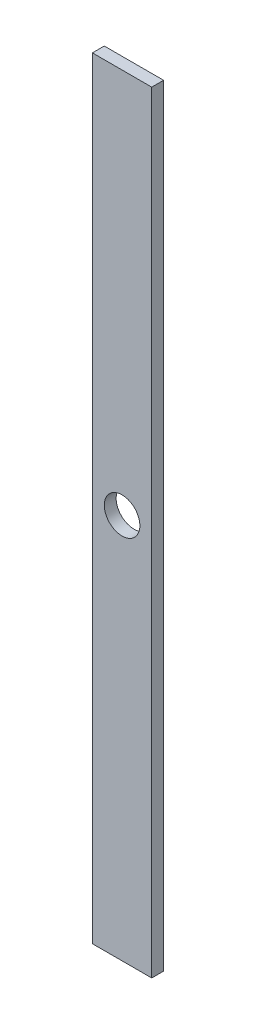
ISO-10303-21;
HEADER;
FILE_DESCRIPTION(('STEP AP214'),'2;1');
FILE_NAME('part.step','',(''),(''),'','','');
FILE_SCHEMA(('AUTOMOTIVE_DESIGN { 1 0 10303 214 1 1 1 1 }'));
ENDSEC;
DATA;
#1=APPLICATION_CONTEXT('core data for automotive mechanical design processes');
#2=APPLICATION_PROTOCOL_DEFINITION('international standard','automotive_design',2000,#1);
#3=PRODUCT_CONTEXT('',#1,'mechanical');
#4=PRODUCT('Part','Part','',(#3));
#5=PRODUCT_RELATED_PRODUCT_CATEGORY('part','',(#4));
#6=PRODUCT_DEFINITION_FORMATION('','',#4);
#7=PRODUCT_DEFINITION_CONTEXT('part definition',#1,'design');
#8=PRODUCT_DEFINITION('design','',#6,#7);
#9=PRODUCT_DEFINITION_SHAPE('','',#8);
#10=(LENGTH_UNIT() NAMED_UNIT(*) SI_UNIT(.MILLI.,.METRE.));
#11=(NAMED_UNIT(*) PLANE_ANGLE_UNIT() SI_UNIT($,.RADIAN.));
#12=(NAMED_UNIT(*) SI_UNIT($,.STERADIAN.) SOLID_ANGLE_UNIT());
#13=UNCERTAINTY_MEASURE_WITH_UNIT(LENGTH_MEASURE(1.E-05),#10,'distance_accuracy_value','');
#14=(GEOMETRIC_REPRESENTATION_CONTEXT(3) GLOBAL_UNCERTAINTY_ASSIGNED_CONTEXT((#13)) GLOBAL_UNIT_ASSIGNED_CONTEXT((#10,
#11,#12)) REPRESENTATION_CONTEXT('',''));
#15=CARTESIAN_POINT('',(0.,0.,0.));
#16=DIRECTION('',(0.,0.,1.));
#17=DIRECTION('',(1.,0.,0.));
#18=AXIS2_PLACEMENT_3D('',#15,#16,#17);
#19=CARTESIAN_POINT('',(0.,0.,10.));
#20=DIRECTION('',(0.,0.,1.));
#21=DIRECTION('',(1.,0.,0.));
#22=AXIS2_PLACEMENT_3D('',#19,#20,#21);
#23=PLANE('',#22);
#24=DIRECTION('',(0.,-1.,0.));
#25=VECTOR('',#24,1.);
#26=CARTESIAN_POINT('',(0.,0.,10.));
#27=LINE('',#26,#25);
#28=CARTESIAN_POINT('',(0.,0.,10.));
#29=VERTEX_POINT('',#28);
#30=CARTESIAN_POINT('',(0.,-650.,10.));
#31=VERTEX_POINT('',#30);
#32=EDGE_CURVE('E85',#29,#31,#27,.T.);
#33=ORIENTED_EDGE('',*,*,#32,.T.);
#34=DIRECTION('',(1.,0.,0.));
#35=VECTOR('',#34,1.);
#36=CARTESIAN_POINT('',(0.,-650.,10.));
#37=LINE('',#36,#35);
#38=CARTESIAN_POINT('',(50.0000000000001,-650.,10.));
#39=VERTEX_POINT('',#38);
#40=EDGE_CURVE('E80',#31,#39,#37,.T.);
#41=ORIENTED_EDGE('',*,*,#40,.T.);
#42=DIRECTION('',(0.,1.,0.));
#43=VECTOR('',#42,1.);
#44=CARTESIAN_POINT('',(50.,0.,10.));
#45=LINE('',#44,#43);
#46=CARTESIAN_POINT('',(50.,0.,10.));
#47=VERTEX_POINT('',#46);
#48=EDGE_CURVE('E83',#39,#47,#45,.T.);
#49=ORIENTED_EDGE('',*,*,#48,.T.);
#50=DIRECTION('',(-1.,0.,0.));
#51=VECTOR('',#50,1.);
#52=CARTESIAN_POINT('',(0.,0.,10.));
#53=LINE('',#52,#51);
#54=EDGE_CURVE('E50',#47,#29,#53,.T.);
#55=ORIENTED_EDGE('',*,*,#54,.T.);
#56=EDGE_LOOP('',(#33,#41,#49,#55));
#57=FACE_BOUND('',#56,.T.);
#58=CARTESIAN_POINT('',(25.,-325.,10.));
#59=DIRECTION('',(0.,0.,1.));
#60=DIRECTION('',(1.,0.,0.));
#61=AXIS2_PLACEMENT_3D('',#58,#59,#60);
#62=CIRCLE('',#61,15.);
#63=CARTESIAN_POINT('',(40.,-325.,10.));
#64=VERTEX_POINT('',#63);
#65=EDGE_CURVE('E100',#64,#64,#62,.T.);
#66=ORIENTED_EDGE('',*,*,#65,.F.);
#67=EDGE_LOOP('',(#66));
#68=FACE_BOUND('',#67,.T.);
#69=ADVANCED_FACE('F33',(#57,#68),#23,.T.);
#70=CARTESIAN_POINT('',(0.,0.,0.));
#71=DIRECTION('',(0.,0.,1.));
#72=DIRECTION('',(1.,0.,0.));
#73=AXIS2_PLACEMENT_3D('',#70,#71,#72);
#74=PLANE('',#73);
#75=DIRECTION('',(0.,-1.,0.));
#76=VECTOR('',#75,1.);
#77=CARTESIAN_POINT('',(0.,0.,0.));
#78=LINE('',#77,#76);
#79=CARTESIAN_POINT('',(0.,0.,0.));
#80=VERTEX_POINT('',#79);
#81=CARTESIAN_POINT('',(0.,-650.,0.));
#82=VERTEX_POINT('',#81);
#83=EDGE_CURVE('E97',#80,#82,#78,.T.);
#84=ORIENTED_EDGE('',*,*,#83,.F.);
#85=DIRECTION('',(-1.,0.,0.));
#86=VECTOR('',#85,1.);
#87=CARTESIAN_POINT('',(0.,0.,0.));
#88=LINE('',#87,#86);
#89=CARTESIAN_POINT('',(50.,0.,0.));
#90=VERTEX_POINT('',#89);
#91=EDGE_CURVE('E73',#90,#80,#88,.T.);
#92=ORIENTED_EDGE('',*,*,#91,.F.);
#93=DIRECTION('',(0.,1.,0.));
#94=VECTOR('',#93,1.);
#95=CARTESIAN_POINT('',(50.,0.,0.));
#96=LINE('',#95,#94);
#97=CARTESIAN_POINT('',(50.0000000000001,-650.,0.));
#98=VERTEX_POINT('',#97);
#99=EDGE_CURVE('E67',#98,#90,#96,.T.);
#100=ORIENTED_EDGE('',*,*,#99,.F.);
#101=DIRECTION('',(1.,0.,0.));
#102=VECTOR('',#101,1.);
#103=CARTESIAN_POINT('',(0.,-650.,0.));
#104=LINE('',#103,#102);
#105=EDGE_CURVE('E89',#82,#98,#104,.T.);
#106=ORIENTED_EDGE('',*,*,#105,.F.);
#107=EDGE_LOOP('',(#84,#92,#100,#106));
#108=FACE_BOUND('',#107,.T.);
#109=CARTESIAN_POINT('',(25.,-325.,0.));
#110=DIRECTION('',(0.,0.,1.));
#111=DIRECTION('',(1.,0.,0.));
#112=AXIS2_PLACEMENT_3D('',#109,#110,#111);
#113=CIRCLE('',#112,15.);
#114=CARTESIAN_POINT('',(40.,-325.,0.));
#115=VERTEX_POINT('',#114);
#116=EDGE_CURVE('E112',#115,#115,#113,.T.);
#117=ORIENTED_EDGE('',*,*,#116,.T.);
#118=EDGE_LOOP('',(#117));
#119=FACE_BOUND('',#118,.T.);
#120=ADVANCED_FACE('F108',(#108,#119),#74,.F.);
#121=CARTESIAN_POINT('',(0.,0.,10.));
#122=DIRECTION('',(1.,0.,0.));
#123=DIRECTION('',(0.,1.,0.));
#124=AXIS2_PLACEMENT_3D('',#121,#122,#123);
#125=PLANE('',#124);
#126=ORIENTED_EDGE('',*,*,#83,.T.);
#127=DIRECTION('',(0.,0.,-1.));
#128=VECTOR('',#127,1.);
#129=CARTESIAN_POINT('',(0.,-650.,10.));
#130=LINE('',#129,#128);
#131=EDGE_CURVE('E11',#31,#82,#130,.T.);
#132=ORIENTED_EDGE('',*,*,#131,.F.);
#133=ORIENTED_EDGE('',*,*,#32,.F.);
#134=DIRECTION('',(0.,0.,-1.));
#135=VECTOR('',#134,1.);
#136=CARTESIAN_POINT('',(0.,0.,10.));
#137=LINE('',#136,#135);
#138=EDGE_CURVE('E93',#29,#80,#137,.T.);
#139=ORIENTED_EDGE('',*,*,#138,.T.);
#140=EDGE_LOOP('',(#126,#132,#133,#139));
#141=FACE_BOUND('',#140,.T.);
#142=ADVANCED_FACE('F35',(#141),#125,.F.);
#143=CARTESIAN_POINT('',(0.,-650.,10.));
#144=DIRECTION('',(0.,1.,0.));
#145=DIRECTION('',(0.,0.,1.));
#146=AXIS2_PLACEMENT_3D('',#143,#144,#145);
#147=PLANE('',#146);
#148=ORIENTED_EDGE('',*,*,#105,.T.);
#149=DIRECTION('',(0.,0.,-1.));
#150=VECTOR('',#149,1.);
#151=CARTESIAN_POINT('',(50.0000000000001,-650.,10.));
#152=LINE('',#151,#150);
#153=EDGE_CURVE('E42',#39,#98,#152,.T.);
#154=ORIENTED_EDGE('',*,*,#153,.F.);
#155=ORIENTED_EDGE('',*,*,#40,.F.);
#156=ORIENTED_EDGE('',*,*,#131,.T.);
#157=EDGE_LOOP('',(#148,#154,#155,#156));
#158=FACE_BOUND('',#157,.T.);
#159=ADVANCED_FACE('F88',(#158),#147,.F.);
#160=CARTESIAN_POINT('',(50.,0.,10.));
#161=DIRECTION('',(-1.,0.,0.));
#162=DIRECTION('',(0.,-1.,0.));
#163=AXIS2_PLACEMENT_3D('',#160,#161,#162);
#164=PLANE('',#163);
#165=ORIENTED_EDGE('',*,*,#99,.T.);
#166=DIRECTION('',(0.,0.,-1.));
#167=VECTOR('',#166,1.);
#168=CARTESIAN_POINT('',(50.,0.,10.));
#169=LINE('',#168,#167);
#170=EDGE_CURVE('E90',#47,#90,#169,.T.);
#171=ORIENTED_EDGE('',*,*,#170,.F.);
#172=ORIENTED_EDGE('',*,*,#48,.F.);
#173=ORIENTED_EDGE('',*,*,#153,.T.);
#174=EDGE_LOOP('',(#165,#171,#172,#173));
#175=FACE_BOUND('',#174,.T.);
#176=ADVANCED_FACE('F91',(#175),#164,.F.);
#177=CARTESIAN_POINT('',(0.,0.,10.));
#178=DIRECTION('',(0.,-1.,0.));
#179=DIRECTION('',(0.,0.,-1.));
#180=AXIS2_PLACEMENT_3D('',#177,#178,#179);
#181=PLANE('',#180);
#182=ORIENTED_EDGE('',*,*,#91,.T.);
#183=ORIENTED_EDGE('',*,*,#138,.F.);
#184=ORIENTED_EDGE('',*,*,#54,.F.);
#185=ORIENTED_EDGE('',*,*,#170,.T.);
#186=EDGE_LOOP('',(#182,#183,#184,#185));
#187=FACE_BOUND('',#186,.T.);
#188=ADVANCED_FACE('F105',(#187),#181,.F.);
#189=CARTESIAN_POINT('',(25.,-325.,10.));
#190=DIRECTION('',(0.,0.,-1.));
#191=DIRECTION('',(-1.,0.,0.));
#192=AXIS2_PLACEMENT_3D('',#189,#190,#191);
#193=CYLINDRICAL_SURFACE('',#192,15.);
#194=ORIENTED_EDGE('',*,*,#65,.T.);
#195=EDGE_LOOP('',(#194));
#196=FACE_BOUND('',#195,.T.);
#197=ORIENTED_EDGE('',*,*,#116,.F.);
#198=EDGE_LOOP('',(#197));
#199=FACE_BOUND('',#198,.T.);
#200=ADVANCED_FACE('F118',(#196,#199),#193,.F.);
#201=CLOSED_SHELL('',(#69,#120,#142,#159,#176,#188,#200));
#202=MANIFOLD_SOLID_BREP('B2',#201);
#203=ADVANCED_BREP_SHAPE_REPRESENTATION('',(#18,#202),#14);
#204=SHAPE_DEFINITION_REPRESENTATION(#9,#203);
ENDSEC;
END-ISO-10303-21;
